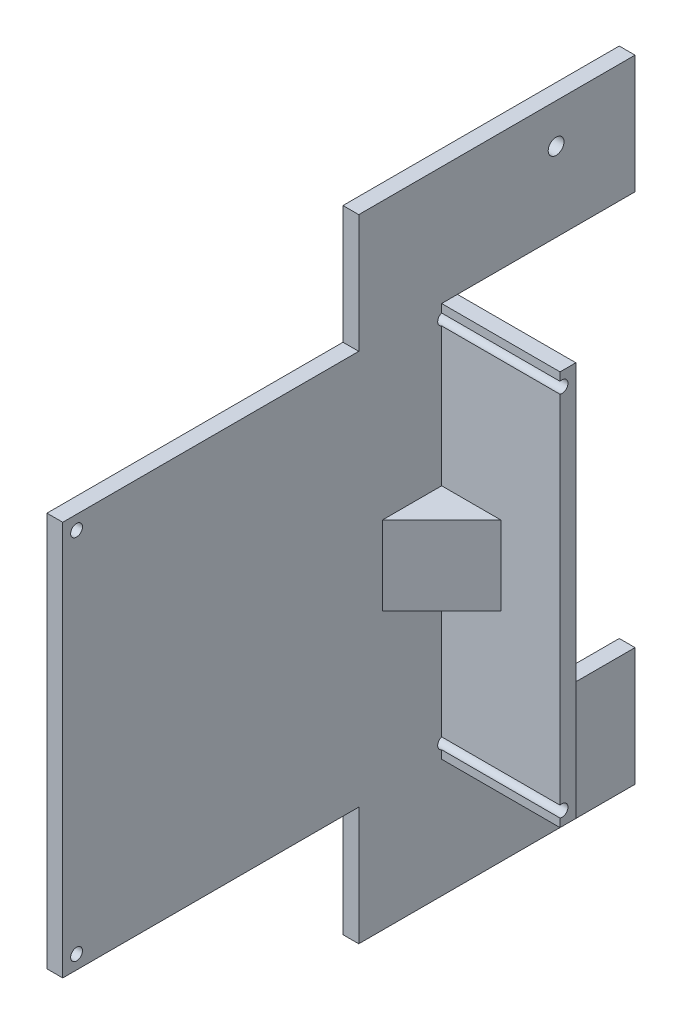
ISO-10303-21;
HEADER;
FILE_DESCRIPTION(('STEP AP214'),'2;1');
FILE_NAME('part.step','',(''),(''),'','','');
FILE_SCHEMA(('AUTOMOTIVE_DESIGN { 1 0 10303 214 1 1 1 1 }'));
ENDSEC;
DATA;
#1=APPLICATION_CONTEXT('core data for automotive mechanical design processes');
#2=APPLICATION_PROTOCOL_DEFINITION('international standard','automotive_design',2000,#1);
#3=PRODUCT_CONTEXT('',#1,'mechanical');
#4=PRODUCT('Part','Part','',(#3));
#5=PRODUCT_RELATED_PRODUCT_CATEGORY('part','',(#4));
#6=PRODUCT_DEFINITION_FORMATION('','',#4);
#7=PRODUCT_DEFINITION_CONTEXT('part definition',#1,'design');
#8=PRODUCT_DEFINITION('design','',#6,#7);
#9=PRODUCT_DEFINITION_SHAPE('','',#8);
#10=(LENGTH_UNIT() NAMED_UNIT(*) SI_UNIT(.MILLI.,.METRE.));
#11=(NAMED_UNIT(*) PLANE_ANGLE_UNIT() SI_UNIT($,.RADIAN.));
#12=(NAMED_UNIT(*) SI_UNIT($,.STERADIAN.) SOLID_ANGLE_UNIT());
#13=UNCERTAINTY_MEASURE_WITH_UNIT(LENGTH_MEASURE(1.E-05),#10,'distance_accuracy_value','');
#14=(GEOMETRIC_REPRESENTATION_CONTEXT(3) GLOBAL_UNCERTAINTY_ASSIGNED_CONTEXT((#13)) GLOBAL_UNIT_ASSIGNED_CONTEXT((#10,
#11,#12)) REPRESENTATION_CONTEXT('',''));
#15=CARTESIAN_POINT('',(0.,0.,0.));
#16=DIRECTION('',(0.,0.,1.));
#17=DIRECTION('',(1.,0.,0.));
#18=AXIS2_PLACEMENT_3D('',#15,#16,#17);
#19=CARTESIAN_POINT('',(34.,50.,-46.));
#20=DIRECTION('',(0.,0.,-1.));
#21=DIRECTION('',(0.,1.,0.));
#22=AXIS2_PLACEMENT_3D('',#19,#20,#21);
#23=PLANE('',#22);
#24=DIRECTION('',(0.,-1.,0.));
#25=VECTOR('',#24,1.);
#26=CARTESIAN_POINT('',(34.,50.,-46.));
#27=LINE('',#26,#25);
#28=CARTESIAN_POINT('',(34.,-47.9142135623731,-46.));
#29=VERTEX_POINT('',#28);
#30=CARTESIAN_POINT('',(34.,-50.,-46.));
#31=VERTEX_POINT('',#30);
#32=EDGE_CURVE('E390',#29,#31,#27,.T.);
#33=ORIENTED_EDGE('',*,*,#32,.F.);
#34=DIRECTION('',(-1.,0.,0.));
#35=VECTOR('',#34,1.);
#36=CARTESIAN_POINT('',(34.,-47.9142135623731,-46.));
#37=LINE('',#36,#35);
#38=CARTESIAN_POINT('',(4.,-47.9142135623731,-46.));
#39=VERTEX_POINT('',#38);
#40=EDGE_CURVE('E72',#29,#39,#37,.T.);
#41=ORIENTED_EDGE('',*,*,#40,.T.);
#42=DIRECTION('',(0.,-1.,0.));
#43=VECTOR('',#42,1.);
#44=CARTESIAN_POINT('',(4.,50.,-46.));
#45=LINE('',#44,#43);
#46=CARTESIAN_POINT('',(4.,-50.,-46.));
#47=VERTEX_POINT('',#46);
#48=EDGE_CURVE('E335',#39,#47,#45,.T.);
#49=ORIENTED_EDGE('',*,*,#48,.T.);
#50=DIRECTION('',(-1.,0.,0.));
#51=VECTOR('',#50,1.);
#52=CARTESIAN_POINT('',(34.,-50.,-46.));
#53=LINE('',#52,#51);
#54=EDGE_CURVE('E400',#31,#47,#53,.T.);
#55=ORIENTED_EDGE('',*,*,#54,.F.);
#56=EDGE_LOOP('',(#33,#41,#49,#55));
#57=FACE_BOUND('',#56,.T.);
#58=ADVANCED_FACE('F45',(#57),#23,.F.);
#59=DIRECTION('',(0.,1.,0.));
#60=VECTOR('',#59,1.);
#61=CARTESIAN_POINT('',(19.,-10.,-46.));
#62=LINE('',#61,#60);
#63=CARTESIAN_POINT('',(19.,-10.,-46.));
#64=VERTEX_POINT('',#63);
#65=CARTESIAN_POINT('',(19.,10.,-46.));
#66=VERTEX_POINT('',#65);
#67=EDGE_CURVE('E204',#64,#66,#62,.T.);
#68=ORIENTED_EDGE('',*,*,#67,.F.);
#69=DIRECTION('',(-1.,0.,0.));
#70=VECTOR('',#69,1.);
#71=CARTESIAN_POINT('',(19.,-10.,-46.));
#72=LINE('',#71,#70);
#73=CARTESIAN_POINT('',(4.,-10.,-46.));
#74=VERTEX_POINT('',#73);
#75=EDGE_CURVE('E220',#64,#74,#72,.T.);
#76=ORIENTED_EDGE('',*,*,#75,.T.);
#77=CARTESIAN_POINT('',(4.,-45.0857864376269,-46.));
#78=VERTEX_POINT('',#77);
#79=EDGE_CURVE('E405',#74,#78,#45,.T.);
#80=ORIENTED_EDGE('',*,*,#79,.T.);
#81=DIRECTION('',(-1.,0.,0.));
#82=VECTOR('',#81,1.);
#83=CARTESIAN_POINT('',(34.,-45.0857864376269,-46.));
#84=LINE('',#83,#82);
#85=CARTESIAN_POINT('',(34.,-45.0857864376269,-46.));
#86=VERTEX_POINT('',#85);
#87=EDGE_CURVE('E263',#78,#86,#84,.F.);
#88=ORIENTED_EDGE('',*,*,#87,.T.);
#89=CARTESIAN_POINT('',(34.,45.0857864376269,-46.));
#90=VERTEX_POINT('',#89);
#91=EDGE_CURVE('E396',#90,#86,#27,.T.);
#92=ORIENTED_EDGE('',*,*,#91,.F.);
#93=DIRECTION('',(-1.,0.,0.));
#94=VECTOR('',#93,1.);
#95=CARTESIAN_POINT('',(34.,45.0857864376269,-46.));
#96=LINE('',#95,#94);
#97=CARTESIAN_POINT('',(4.,45.0857864376269,-46.));
#98=VERTEX_POINT('',#97);
#99=EDGE_CURVE('E259',#90,#98,#96,.T.);
#100=ORIENTED_EDGE('',*,*,#99,.T.);
#101=CARTESIAN_POINT('',(4.,10.,-46.));
#102=VERTEX_POINT('',#101);
#103=EDGE_CURVE('E404',#98,#102,#45,.T.);
#104=ORIENTED_EDGE('',*,*,#103,.T.);
#105=DIRECTION('',(-1.,0.,0.));
#106=VECTOR('',#105,1.);
#107=CARTESIAN_POINT('',(19.,10.,-46.));
#108=LINE('',#107,#106);
#109=EDGE_CURVE('E64',#66,#102,#108,.T.);
#110=ORIENTED_EDGE('',*,*,#109,.F.);
#111=EDGE_LOOP('',(#68,#76,#80,#88,#92,#100,#104,#110));
#112=FACE_BOUND('',#111,.T.);
#113=ADVANCED_FACE('F502',(#112),#23,.F.);
#114=CARTESIAN_POINT('',(4.,-50.,50.));
#115=DIRECTION('',(0.,1.,0.));
#116=DIRECTION('',(0.,0.,1.));
#117=AXIS2_PLACEMENT_3D('',#114,#115,#116);
#118=PLANE('',#117);
#119=DIRECTION('',(-1.,0.,0.));
#120=VECTOR('',#119,1.);
#121=CARTESIAN_POINT('',(4.,-50.,-25.));
#122=LINE('',#121,#120);
#123=CARTESIAN_POINT('',(4.,-50.,-25.));
#124=VERTEX_POINT('',#123);
#125=CARTESIAN_POINT('',(0.,-50.,-25.));
#126=VERTEX_POINT('',#125);
#127=EDGE_CURVE('E344',#124,#126,#122,.T.);
#128=ORIENTED_EDGE('',*,*,#127,.F.);
#129=DIRECTION('',(0.,0.,-1.));
#130=VECTOR('',#129,1.);
#131=CARTESIAN_POINT('',(4.,-50.,50.));
#132=LINE('',#131,#130);
#133=CARTESIAN_POINT('',(4.,-50.,50.));
#134=VERTEX_POINT('',#133);
#135=EDGE_CURVE('E418',#134,#124,#132,.T.);
#136=ORIENTED_EDGE('',*,*,#135,.F.);
#137=DIRECTION('',(-1.,0.,0.));
#138=VECTOR('',#137,1.);
#139=CARTESIAN_POINT('',(4.,-50.,50.));
#140=LINE('',#139,#138);
#141=CARTESIAN_POINT('',(0.,-50.,50.));
#142=VERTEX_POINT('',#141);
#143=EDGE_CURVE('E49',#134,#142,#140,.T.);
#144=ORIENTED_EDGE('',*,*,#143,.T.);
#145=DIRECTION('',(0.,0.,-1.));
#146=VECTOR('',#145,1.);
#147=CARTESIAN_POINT('',(0.,-50.,50.));
#148=LINE('',#147,#146);
#149=EDGE_CURVE('E430',#142,#126,#148,.T.);
#150=ORIENTED_EDGE('',*,*,#149,.T.);
#151=EDGE_LOOP('',(#128,#136,#144,#150));
#152=FACE_BOUND('',#151,.T.);
#153=ADVANCED_FACE('F530',(#152),#118,.F.);
#154=CARTESIAN_POINT('',(4.,50.,50.));
#155=DIRECTION('',(0.,-1.,0.));
#156=DIRECTION('',(0.,0.,-1.));
#157=AXIS2_PLACEMENT_3D('',#154,#155,#156);
#158=PLANE('',#157);
#159=DIRECTION('',(-1.,0.,0.));
#160=VECTOR('',#159,1.);
#161=CARTESIAN_POINT('',(4.,50.,-50.));
#162=LINE('',#161,#160);
#163=CARTESIAN_POINT('',(34.,50.,-50.));
#164=VERTEX_POINT('',#163);
#165=CARTESIAN_POINT('',(4.,50.,-50.));
#166=VERTEX_POINT('',#165);
#167=EDGE_CURVE('E444',#164,#166,#162,.T.);
#168=ORIENTED_EDGE('',*,*,#167,.T.);
#169=DIRECTION('',(0.,0.,1.));
#170=VECTOR('',#169,1.);
#171=CARTESIAN_POINT('',(4.,50.,-25.));
#172=LINE('',#171,#170);
#173=CARTESIAN_POINT('',(4.,50.,-46.));
#174=VERTEX_POINT('',#173);
#175=EDGE_CURVE('E55',#166,#174,#172,.T.);
#176=ORIENTED_EDGE('',*,*,#175,.T.);
#177=DIRECTION('',(-1.,0.,0.));
#178=VECTOR('',#177,1.);
#179=CARTESIAN_POINT('',(34.,50.,-46.));
#180=LINE('',#179,#178);
#181=CARTESIAN_POINT('',(34.,50.,-46.));
#182=VERTEX_POINT('',#181);
#183=EDGE_CURVE('E409',#182,#174,#180,.T.);
#184=ORIENTED_EDGE('',*,*,#183,.F.);
#185=DIRECTION('',(0.,0.,1.));
#186=VECTOR('',#185,1.);
#187=CARTESIAN_POINT('',(34.,50.,-50.));
#188=LINE('',#187,#186);
#189=EDGE_CURVE('E386',#164,#182,#188,.T.);
#190=ORIENTED_EDGE('',*,*,#189,.F.);
#191=EDGE_LOOP('',(#168,#176,#184,#190));
#192=FACE_BOUND('',#191,.T.);
#193=ADVANCED_FACE('F492',(#192),#158,.F.);
#194=CARTESIAN_POINT('',(4.,50.,50.));
#195=DIRECTION('',(0.,0.,-1.));
#196=DIRECTION('',(0.,1.,0.));
#197=AXIS2_PLACEMENT_3D('',#194,#195,#196);
#198=PLANE('',#197);
#199=DIRECTION('',(0.,-1.,0.));
#200=VECTOR('',#199,1.);
#201=CARTESIAN_POINT('',(0.,50.,50.));
#202=LINE('',#201,#200);
#203=CARTESIAN_POINT('',(0.,50.,50.));
#204=VERTEX_POINT('',#203);
#205=EDGE_CURVE('E413',#204,#142,#202,.T.);
#206=ORIENTED_EDGE('',*,*,#205,.T.);
#207=ORIENTED_EDGE('',*,*,#143,.F.);
#208=DIRECTION('',(0.,-1.,0.));
#209=VECTOR('',#208,1.);
#210=CARTESIAN_POINT('',(4.,50.,50.));
#211=LINE('',#210,#209);
#212=CARTESIAN_POINT('',(4.,50.,50.));
#213=VERTEX_POINT('',#212);
#214=EDGE_CURVE('E414',#213,#134,#211,.T.);
#215=ORIENTED_EDGE('',*,*,#214,.F.);
#216=DIRECTION('',(-1.,0.,0.));
#217=VECTOR('',#216,1.);
#218=CARTESIAN_POINT('',(4.,50.,50.));
#219=LINE('',#218,#217);
#220=EDGE_CURVE('E426',#213,#204,#219,.T.);
#221=ORIENTED_EDGE('',*,*,#220,.T.);
#222=EDGE_LOOP('',(#206,#207,#215,#221));
#223=FACE_BOUND('',#222,.T.);
#224=ADVANCED_FACE('F47',(#223),#198,.F.);
#225=ORIENTED_EDGE('',*,*,#54,.T.);
#226=DIRECTION('',(0.,0.,-1.));
#227=VECTOR('',#226,1.);
#228=CARTESIAN_POINT('',(4.,-50.,-25.));
#229=LINE('',#228,#227);
#230=CARTESIAN_POINT('',(4.,-50.,-50.));
#231=VERTEX_POINT('',#230);
#232=EDGE_CURVE('E11',#47,#231,#229,.T.);
#233=ORIENTED_EDGE('',*,*,#232,.T.);
#234=DIRECTION('',(-1.,0.,0.));
#235=VECTOR('',#234,1.);
#236=CARTESIAN_POINT('',(4.,-50.,-50.));
#237=LINE('',#236,#235);
#238=CARTESIAN_POINT('',(34.,-50.,-50.));
#239=VERTEX_POINT('',#238);
#240=EDGE_CURVE('E448',#239,#231,#237,.T.);
#241=ORIENTED_EDGE('',*,*,#240,.F.);
#242=DIRECTION('',(0.,0.,-1.));
#243=VECTOR('',#242,1.);
#244=CARTESIAN_POINT('',(34.,-50.,-50.));
#245=LINE('',#244,#243);
#246=EDGE_CURVE('E395',#31,#239,#245,.T.);
#247=ORIENTED_EDGE('',*,*,#246,.F.);
#248=EDGE_LOOP('',(#225,#233,#241,#247));
#249=FACE_BOUND('',#248,.T.);
#250=ADVANCED_FACE('F486',(#249),#118,.F.);
#251=CARTESIAN_POINT('',(4.,50.,-50.));
#252=DIRECTION('',(0.,0.,1.));
#253=DIRECTION('',(0.,-1.,0.));
#254=AXIS2_PLACEMENT_3D('',#251,#252,#253);
#255=PLANE('',#254);
#256=DIRECTION('',(0.,1.,0.));
#257=VECTOR('',#256,1.);
#258=CARTESIAN_POINT('',(0.,50.,-50.));
#259=LINE('',#258,#257);
#260=CARTESIAN_POINT('',(0.,-50.,-50.));
#261=VERTEX_POINT('',#260);
#262=CARTESIAN_POINT('',(0.,50.,-50.));
#263=VERTEX_POINT('',#262);
#264=EDGE_CURVE('E434',#261,#263,#259,.T.);
#265=ORIENTED_EDGE('',*,*,#264,.T.);
#266=EDGE_CURVE('E443',#166,#263,#162,.T.);
#267=ORIENTED_EDGE('',*,*,#266,.F.);
#268=ORIENTED_EDGE('',*,*,#167,.F.);
#269=DIRECTION('',(0.,1.,0.));
#270=VECTOR('',#269,1.);
#271=CARTESIAN_POINT('',(34.,50.,-50.));
#272=LINE('',#271,#270);
#273=EDGE_CURVE('E382',#239,#164,#272,.T.);
#274=ORIENTED_EDGE('',*,*,#273,.F.);
#275=ORIENTED_EDGE('',*,*,#240,.T.);
#276=EDGE_CURVE('E447',#231,#261,#237,.T.);
#277=ORIENTED_EDGE('',*,*,#276,.T.);
#278=EDGE_LOOP('',(#265,#267,#268,#274,#275,#277));
#279=FACE_BOUND('',#278,.T.);
#280=ADVANCED_FACE('F459',(#279),#255,.F.);
#281=DIRECTION('',(0.,0.,1.));
#282=VECTOR('',#281,1.);
#283=CARTESIAN_POINT('',(4.,50.,50.));
#284=LINE('',#283,#282);
#285=CARTESIAN_POINT('',(4.,50.,-25.));
#286=VERTEX_POINT('',#285);
#287=EDGE_CURVE('E423',#286,#213,#284,.T.);
#288=ORIENTED_EDGE('',*,*,#287,.F.);
#289=DIRECTION('',(-1.,0.,0.));
#290=VECTOR('',#289,1.);
#291=CARTESIAN_POINT('',(4.,50.,-25.));
#292=LINE('',#291,#290);
#293=CARTESIAN_POINT('',(0.,50.,-25.));
#294=VERTEX_POINT('',#293);
#295=EDGE_CURVE('E331',#286,#294,#292,.T.);
#296=ORIENTED_EDGE('',*,*,#295,.T.);
#297=DIRECTION('',(0.,0.,1.));
#298=VECTOR('',#297,1.);
#299=CARTESIAN_POINT('',(0.,50.,50.));
#300=LINE('',#299,#298);
#301=EDGE_CURVE('E419',#294,#204,#300,.T.);
#302=ORIENTED_EDGE('',*,*,#301,.T.);
#303=ORIENTED_EDGE('',*,*,#220,.F.);
#304=EDGE_LOOP('',(#288,#296,#302,#303));
#305=FACE_BOUND('',#304,.T.);
#306=ADVANCED_FACE('F543',(#305),#158,.F.);
#307=CARTESIAN_POINT('',(4.,0.,0.));
#308=DIRECTION('',(1.,0.,0.));
#309=DIRECTION('',(0.,0.,-1.));
#310=AXIS2_PLACEMENT_3D('',#307,#308,#309);
#311=PLANE('',#310);
#312=DIRECTION('',(0.,0.,1.));
#313=VECTOR('',#312,1.);
#314=CARTESIAN_POINT('',(4.,-10.,-46.));
#315=LINE('',#314,#313);
#316=CARTESIAN_POINT('',(4.,-10.,-31.));
#317=VERTEX_POINT('',#316);
#318=EDGE_CURVE('E218',#74,#317,#315,.T.);
#319=ORIENTED_EDGE('',*,*,#318,.T.);
#320=DIRECTION('',(0.,1.,0.));
#321=VECTOR('',#320,1.);
#322=CARTESIAN_POINT('',(4.,-10.,-31.));
#323=LINE('',#322,#321);
#324=CARTESIAN_POINT('',(4.,10.,-31.));
#325=VERTEX_POINT('',#324);
#326=EDGE_CURVE('E201',#317,#325,#323,.T.);
#327=ORIENTED_EDGE('',*,*,#326,.T.);
#328=DIRECTION('',(0.,0.,1.));
#329=VECTOR('',#328,1.);
#330=CARTESIAN_POINT('',(4.,10.,-46.));
#331=LINE('',#330,#329);
#332=EDGE_CURVE('E206',#102,#325,#331,.T.);
#333=ORIENTED_EDGE('',*,*,#332,.F.);
#334=ORIENTED_EDGE('',*,*,#103,.F.);
#335=CARTESIAN_POINT('',(4.,46.5,-46.5));
#336=DIRECTION('',(1.,0.,0.));
#337=DIRECTION('',(0.,0.,-1.));
#338=AXIS2_PLACEMENT_3D('',#335,#336,#337);
#339=CIRCLE('',#338,1.5);
#340=CARTESIAN_POINT('',(4.,47.9142135623731,-46.));
#341=VERTEX_POINT('',#340);
#342=EDGE_CURVE('E256',#341,#98,#339,.T.);
#343=ORIENTED_EDGE('',*,*,#342,.F.);
#344=EDGE_CURVE('E387',#174,#341,#45,.T.);
#345=ORIENTED_EDGE('',*,*,#344,.F.);
#346=ORIENTED_EDGE('',*,*,#175,.F.);
#347=CARTESIAN_POINT('',(4.,50.,-95.));
#348=VERTEX_POINT('',#347);
#349=EDGE_CURVE('E310',#348,#166,#172,.T.);
#350=ORIENTED_EDGE('',*,*,#349,.F.);
#351=DIRECTION('',(0.,-1.,0.));
#352=VECTOR('',#351,1.);
#353=CARTESIAN_POINT('',(4.,50.,-95.));
#354=LINE('',#353,#352);
#355=CARTESIAN_POINT('',(4.,80.,-95.));
#356=VERTEX_POINT('',#355);
#357=EDGE_CURVE('E306',#356,#348,#354,.T.);
#358=ORIENTED_EDGE('',*,*,#357,.F.);
#359=DIRECTION('',(0.,0.,-1.));
#360=VECTOR('',#359,1.);
#361=CARTESIAN_POINT('',(4.,80.,-25.));
#362=LINE('',#361,#360);
#363=CARTESIAN_POINT('',(4.,80.,-25.));
#364=VERTEX_POINT('',#363);
#365=EDGE_CURVE('E301',#364,#356,#362,.T.);
#366=ORIENTED_EDGE('',*,*,#365,.F.);
#367=DIRECTION('',(0.,1.,0.));
#368=VECTOR('',#367,1.);
#369=CARTESIAN_POINT('',(4.,50.,-25.));
#370=LINE('',#369,#368);
#371=EDGE_CURVE('E297',#286,#364,#370,.T.);
#372=ORIENTED_EDGE('',*,*,#371,.F.);
#373=ORIENTED_EDGE('',*,*,#287,.T.);
#374=ORIENTED_EDGE('',*,*,#214,.T.);
#375=ORIENTED_EDGE('',*,*,#135,.T.);
#376=DIRECTION('',(0.,1.,0.));
#377=VECTOR('',#376,1.);
#378=CARTESIAN_POINT('',(4.,-50.,-25.));
#379=LINE('',#378,#377);
#380=CARTESIAN_POINT('',(4.,-80.,-25.));
#381=VERTEX_POINT('',#380);
#382=EDGE_CURVE('E362',#381,#124,#379,.T.);
#383=ORIENTED_EDGE('',*,*,#382,.F.);
#384=DIRECTION('',(0.,0.,1.));
#385=VECTOR('',#384,1.);
#386=CARTESIAN_POINT('',(4.,-80.,-25.));
#387=LINE('',#386,#385);
#388=CARTESIAN_POINT('',(4.,-80.,-95.));
#389=VERTEX_POINT('',#388);
#390=EDGE_CURVE('E347',#389,#381,#387,.T.);
#391=ORIENTED_EDGE('',*,*,#390,.F.);
#392=DIRECTION('',(0.,-1.,0.));
#393=VECTOR('',#392,1.);
#394=CARTESIAN_POINT('',(4.,-50.,-95.));
#395=LINE('',#394,#393);
#396=CARTESIAN_POINT('',(4.,-50.,-95.));
#397=VERTEX_POINT('',#396);
#398=EDGE_CURVE('E375',#397,#389,#395,.T.);
#399=ORIENTED_EDGE('',*,*,#398,.F.);
#400=EDGE_CURVE('E57',#231,#397,#229,.T.);
#401=ORIENTED_EDGE('',*,*,#400,.F.);
#402=ORIENTED_EDGE('',*,*,#232,.F.);
#403=ORIENTED_EDGE('',*,*,#48,.F.);
#404=CARTESIAN_POINT('',(4.,-46.5,-46.5));
#405=DIRECTION('',(1.,0.,0.));
#406=DIRECTION('',(0.,0.,-1.));
#407=AXIS2_PLACEMENT_3D('',#404,#405,#406);
#408=CIRCLE('',#407,1.5);
#409=EDGE_CURVE('E267',#78,#39,#408,.T.);
#410=ORIENTED_EDGE('',*,*,#409,.F.);
#411=ORIENTED_EDGE('',*,*,#79,.F.);
#412=EDGE_LOOP('',(#319,#327,#333,#334,#343,#345,#346,#350,#358,#366,#372,#373,#374,#375,#383,
#391,#399,#401,#402,#403,#410,#411));
#413=FACE_BOUND('',#412,.T.);
#414=CARTESIAN_POINT('',(4.,-46.5,46.5));
#415=DIRECTION('',(1.,0.,0.));
#416=DIRECTION('',(0.,0.,-1.));
#417=AXIS2_PLACEMENT_3D('',#414,#415,#416);
#418=CIRCLE('',#417,1.5);
#419=CARTESIAN_POINT('',(4.,-46.5,45.));
#420=VERTEX_POINT('',#419);
#421=EDGE_CURVE('E276',#420,#420,#418,.T.);
#422=ORIENTED_EDGE('',*,*,#421,.F.);
#423=EDGE_LOOP('',(#422));
#424=FACE_BOUND('',#423,.T.);
#425=CARTESIAN_POINT('',(4.,46.5,46.5));
#426=DIRECTION('',(1.,0.,0.));
#427=DIRECTION('',(0.,0.,-1.));
#428=AXIS2_PLACEMENT_3D('',#425,#426,#427);
#429=CIRCLE('',#428,1.5);
#430=CARTESIAN_POINT('',(4.,46.5,45.));
#431=VERTEX_POINT('',#430);
#432=EDGE_CURVE('E272',#431,#431,#429,.T.);
#433=ORIENTED_EDGE('',*,*,#432,.F.);
#434=EDGE_LOOP('',(#433));
#435=FACE_BOUND('',#434,.T.);
#436=CARTESIAN_POINT('',(4.,70.,-75.));
#437=DIRECTION('',(1.,0.,0.));
#438=DIRECTION('',(0.,0.,-1.));
#439=AXIS2_PLACEMENT_3D('',#436,#437,#438);
#440=CIRCLE('',#439,2.);
#441=CARTESIAN_POINT('',(4.,70.,-77.));
#442=VERTEX_POINT('',#441);
#443=EDGE_CURVE('E286',#442,#442,#440,.T.);
#444=ORIENTED_EDGE('',*,*,#443,.F.);
#445=EDGE_LOOP('',(#444));
#446=FACE_BOUND('',#445,.T.);
#447=CARTESIAN_POINT('',(4.,-70.,-75.));
#448=DIRECTION('',(1.,0.,0.));
#449=DIRECTION('',(0.,0.,-1.));
#450=AXIS2_PLACEMENT_3D('',#447,#448,#449);
#451=CIRCLE('',#450,2.);
#452=CARTESIAN_POINT('',(4.,-70.,-77.));
#453=VERTEX_POINT('',#452);
#454=EDGE_CURVE('E290',#453,#453,#451,.T.);
#455=ORIENTED_EDGE('',*,*,#454,.F.);
#456=EDGE_LOOP('',(#455));
#457=FACE_BOUND('',#456,.T.);
#458=ADVANCED_FACE('F215',(#413,#424,#435,#446,#457),#311,.T.);
#459=CARTESIAN_POINT('',(0.,0.,0.));
#460=DIRECTION('',(1.,0.,0.));
#461=DIRECTION('',(0.,0.,-1.));
#462=AXIS2_PLACEMENT_3D('',#459,#460,#461);
#463=PLANE('',#462);
#464=CARTESIAN_POINT('',(0.,-46.5,46.5));
#465=DIRECTION('',(-1.,0.,0.));
#466=DIRECTION('',(0.,0.,1.));
#467=AXIS2_PLACEMENT_3D('',#464,#465,#466);
#468=CIRCLE('',#467,1.5);
#469=CARTESIAN_POINT('',(0.,-46.5,48.));
#470=VERTEX_POINT('',#469);
#471=EDGE_CURVE('E224',#470,#470,#468,.T.);
#472=ORIENTED_EDGE('',*,*,#471,.F.);
#473=EDGE_LOOP('',(#472));
#474=FACE_BOUND('',#473,.T.);
#475=CARTESIAN_POINT('',(0.,-46.5,-46.5));
#476=DIRECTION('',(-1.,0.,0.));
#477=DIRECTION('',(0.,0.,1.));
#478=AXIS2_PLACEMENT_3D('',#475,#476,#477);
#479=CIRCLE('',#478,1.5);
#480=CARTESIAN_POINT('',(0.,-46.5,-45.));
#481=VERTEX_POINT('',#480);
#482=EDGE_CURVE('E239',#481,#481,#479,.T.);
#483=ORIENTED_EDGE('',*,*,#482,.F.);
#484=EDGE_LOOP('',(#483));
#485=FACE_BOUND('',#484,.T.);
#486=CARTESIAN_POINT('',(0.,46.5,-46.5));
#487=DIRECTION('',(-1.,0.,0.));
#488=DIRECTION('',(0.,0.,1.));
#489=AXIS2_PLACEMENT_3D('',#486,#487,#488);
#490=CIRCLE('',#489,1.5);
#491=CARTESIAN_POINT('',(0.,46.5,-45.));
#492=VERTEX_POINT('',#491);
#493=EDGE_CURVE('E230',#492,#492,#490,.T.);
#494=ORIENTED_EDGE('',*,*,#493,.F.);
#495=EDGE_LOOP('',(#494));
#496=FACE_BOUND('',#495,.T.);
#497=CARTESIAN_POINT('',(0.,46.5,46.5));
#498=DIRECTION('',(-1.,0.,0.));
#499=DIRECTION('',(0.,0.,1.));
#500=AXIS2_PLACEMENT_3D('',#497,#498,#499);
#501=CIRCLE('',#500,1.5);
#502=CARTESIAN_POINT('',(0.,46.5,48.));
#503=VERTEX_POINT('',#502);
#504=EDGE_CURVE('E234',#503,#503,#501,.T.);
#505=ORIENTED_EDGE('',*,*,#504,.F.);
#506=EDGE_LOOP('',(#505));
#507=FACE_BOUND('',#506,.T.);
#508=CARTESIAN_POINT('',(0.,70.,-75.));
#509=DIRECTION('',(1.,0.,0.));
#510=DIRECTION('',(0.,0.,-1.));
#511=AXIS2_PLACEMENT_3D('',#508,#509,#510);
#512=CIRCLE('',#511,2.);
#513=CARTESIAN_POINT('',(0.,70.,-77.));
#514=VERTEX_POINT('',#513);
#515=EDGE_CURVE('E281',#514,#514,#512,.T.);
#516=ORIENTED_EDGE('',*,*,#515,.T.);
#517=EDGE_LOOP('',(#516));
#518=FACE_BOUND('',#517,.T.);
#519=CARTESIAN_POINT('',(0.,-70.,-75.));
#520=DIRECTION('',(1.,0.,0.));
#521=DIRECTION('',(0.,0.,-1.));
#522=AXIS2_PLACEMENT_3D('',#519,#520,#521);
#523=CIRCLE('',#522,2.);
#524=CARTESIAN_POINT('',(0.,-70.,-77.));
#525=VERTEX_POINT('',#524);
#526=EDGE_CURVE('E280',#525,#525,#523,.T.);
#527=ORIENTED_EDGE('',*,*,#526,.T.);
#528=EDGE_LOOP('',(#527));
#529=FACE_BOUND('',#528,.T.);
#530=ORIENTED_EDGE('',*,*,#205,.F.);
#531=ORIENTED_EDGE('',*,*,#301,.F.);
#532=DIRECTION('',(0.,1.,0.));
#533=VECTOR('',#532,1.);
#534=CARTESIAN_POINT('',(0.,50.,-25.));
#535=LINE('',#534,#533);
#536=CARTESIAN_POINT('',(0.,80.,-25.));
#537=VERTEX_POINT('',#536);
#538=EDGE_CURVE('E315',#294,#537,#535,.T.);
#539=ORIENTED_EDGE('',*,*,#538,.T.);
#540=DIRECTION('',(0.,0.,-1.));
#541=VECTOR('',#540,1.);
#542=CARTESIAN_POINT('',(0.,80.,-25.));
#543=LINE('',#542,#541);
#544=CARTESIAN_POINT('',(0.,80.,-95.));
#545=VERTEX_POINT('',#544);
#546=EDGE_CURVE('E319',#537,#545,#543,.T.);
#547=ORIENTED_EDGE('',*,*,#546,.T.);
#548=DIRECTION('',(0.,-1.,0.));
#549=VECTOR('',#548,1.);
#550=CARTESIAN_POINT('',(0.,50.,-95.));
#551=LINE('',#550,#549);
#552=CARTESIAN_POINT('',(0.,50.,-95.));
#553=VERTEX_POINT('',#552);
#554=EDGE_CURVE('E324',#545,#553,#551,.T.);
#555=ORIENTED_EDGE('',*,*,#554,.T.);
#556=DIRECTION('',(0.,0.,1.));
#557=VECTOR('',#556,1.);
#558=CARTESIAN_POINT('',(0.,50.,-25.));
#559=LINE('',#558,#557);
#560=EDGE_CURVE('E302',#553,#263,#559,.T.);
#561=ORIENTED_EDGE('',*,*,#560,.T.);
#562=ORIENTED_EDGE('',*,*,#264,.F.);
#563=DIRECTION('',(0.,0.,-1.));
#564=VECTOR('',#563,1.);
#565=CARTESIAN_POINT('',(0.,-50.,-25.));
#566=LINE('',#565,#564);
#567=CARTESIAN_POINT('',(0.,-50.,-95.));
#568=VERTEX_POINT('',#567);
#569=EDGE_CURVE('E366',#261,#568,#566,.T.);
#570=ORIENTED_EDGE('',*,*,#569,.T.);
#571=DIRECTION('',(0.,-1.,0.));
#572=VECTOR('',#571,1.);
#573=CARTESIAN_POINT('',(0.,-50.,-95.));
#574=LINE('',#573,#572);
#575=CARTESIAN_POINT('',(0.,-80.,-95.));
#576=VERTEX_POINT('',#575);
#577=EDGE_CURVE('E361',#568,#576,#574,.T.);
#578=ORIENTED_EDGE('',*,*,#577,.T.);
#579=DIRECTION('',(0.,0.,1.));
#580=VECTOR('',#579,1.);
#581=CARTESIAN_POINT('',(0.,-80.,-25.));
#582=LINE('',#581,#580);
#583=CARTESIAN_POINT('',(0.,-80.,-25.));
#584=VERTEX_POINT('',#583);
#585=EDGE_CURVE('E357',#576,#584,#582,.T.);
#586=ORIENTED_EDGE('',*,*,#585,.T.);
#587=DIRECTION('',(0.,1.,0.));
#588=VECTOR('',#587,1.);
#589=CARTESIAN_POINT('',(0.,-50.,-25.));
#590=LINE('',#589,#588);
#591=EDGE_CURVE('E320',#584,#126,#590,.T.);
#592=ORIENTED_EDGE('',*,*,#591,.T.);
#593=ORIENTED_EDGE('',*,*,#149,.F.);
#594=EDGE_LOOP('',(#530,#531,#539,#547,#555,#561,#562,#570,#578,#586,#592,#593));
#595=FACE_BOUND('',#594,.T.);
#596=ADVANCED_FACE('F464',(#474,#485,#496,#507,#518,#529,#595),#463,.F.);
#597=ORIENTED_EDGE('',*,*,#344,.T.);
#598=DIRECTION('',(-1.,0.,0.));
#599=VECTOR('',#598,1.);
#600=CARTESIAN_POINT('',(34.,47.9142135623731,-46.));
#601=LINE('',#600,#599);
#602=CARTESIAN_POINT('',(34.,47.9142135623731,-46.));
#603=VERTEX_POINT('',#602);
#604=EDGE_CURVE('E252',#341,#603,#601,.F.);
#605=ORIENTED_EDGE('',*,*,#604,.T.);
#606=EDGE_CURVE('E391',#182,#603,#27,.T.);
#607=ORIENTED_EDGE('',*,*,#606,.F.);
#608=ORIENTED_EDGE('',*,*,#183,.T.);
#609=EDGE_LOOP('',(#597,#605,#607,#608));
#610=FACE_BOUND('',#609,.T.);
#611=ADVANCED_FACE('F496',(#610),#23,.F.);
#612=CARTESIAN_POINT('',(34.,0.,0.));
#613=DIRECTION('',(-1.,0.,0.));
#614=DIRECTION('',(0.,0.,1.));
#615=AXIS2_PLACEMENT_3D('',#612,#613,#614);
#616=PLANE('',#615);
#617=ORIENTED_EDGE('',*,*,#91,.T.);
#618=CARTESIAN_POINT('',(34.,-46.5,-46.5));
#619=DIRECTION('',(-1.,0.,0.));
#620=DIRECTION('',(0.,0.,1.));
#621=AXIS2_PLACEMENT_3D('',#618,#619,#620);
#622=CIRCLE('',#621,1.5);
#623=EDGE_CURVE('E243',#86,#29,#622,.T.);
#624=ORIENTED_EDGE('',*,*,#623,.T.);
#625=ORIENTED_EDGE('',*,*,#32,.T.);
#626=ORIENTED_EDGE('',*,*,#246,.T.);
#627=ORIENTED_EDGE('',*,*,#273,.T.);
#628=ORIENTED_EDGE('',*,*,#189,.T.);
#629=ORIENTED_EDGE('',*,*,#606,.T.);
#630=CARTESIAN_POINT('',(34.,46.5,-46.5));
#631=DIRECTION('',(-1.,0.,0.));
#632=DIRECTION('',(0.,0.,1.));
#633=AXIS2_PLACEMENT_3D('',#630,#631,#632);
#634=CIRCLE('',#633,1.5);
#635=EDGE_CURVE('E235',#603,#90,#634,.T.);
#636=ORIENTED_EDGE('',*,*,#635,.T.);
#637=EDGE_LOOP('',(#617,#624,#625,#626,#627,#628,#629,#636));
#638=FACE_BOUND('',#637,.T.);
#639=ADVANCED_FACE('F488',(#638),#616,.F.);
#640=CARTESIAN_POINT('',(4.,50.,-25.));
#641=DIRECTION('',(0.,0.,1.));
#642=DIRECTION('',(1.,0.,0.));
#643=AXIS2_PLACEMENT_3D('',#640,#641,#642);
#644=PLANE('',#643);
#645=ORIENTED_EDGE('',*,*,#538,.F.);
#646=ORIENTED_EDGE('',*,*,#295,.F.);
#647=ORIENTED_EDGE('',*,*,#371,.T.);
#648=DIRECTION('',(-1.,0.,0.));
#649=VECTOR('',#648,1.);
#650=CARTESIAN_POINT('',(4.,80.,-25.));
#651=LINE('',#650,#649);
#652=EDGE_CURVE('E314',#364,#537,#651,.T.);
#653=ORIENTED_EDGE('',*,*,#652,.T.);
#654=EDGE_LOOP('',(#645,#646,#647,#653));
#655=FACE_BOUND('',#654,.T.);
#656=ADVANCED_FACE('F537',(#655),#644,.T.);
#657=CARTESIAN_POINT('',(4.,50.,-25.));
#658=DIRECTION('',(0.,-1.,0.));
#659=DIRECTION('',(0.,0.,-1.));
#660=AXIS2_PLACEMENT_3D('',#657,#658,#659);
#661=PLANE('',#660);
#662=ORIENTED_EDGE('',*,*,#349,.T.);
#663=ORIENTED_EDGE('',*,*,#266,.T.);
#664=ORIENTED_EDGE('',*,*,#560,.F.);
#665=DIRECTION('',(-1.,0.,0.));
#666=VECTOR('',#665,1.);
#667=CARTESIAN_POINT('',(4.,50.,-95.));
#668=LINE('',#667,#666);
#669=EDGE_CURVE('E336',#348,#553,#668,.T.);
#670=ORIENTED_EDGE('',*,*,#669,.F.);
#671=EDGE_LOOP('',(#662,#663,#664,#670));
#672=FACE_BOUND('',#671,.T.);
#673=ADVANCED_FACE('F468',(#672),#661,.T.);
#674=CARTESIAN_POINT('',(4.,50.,-95.));
#675=DIRECTION('',(0.,0.,-1.));
#676=DIRECTION('',(-1.,0.,0.));
#677=AXIS2_PLACEMENT_3D('',#674,#675,#676);
#678=PLANE('',#677);
#679=ORIENTED_EDGE('',*,*,#554,.F.);
#680=DIRECTION('',(-1.,0.,0.));
#681=VECTOR('',#680,1.);
#682=CARTESIAN_POINT('',(4.,80.,-95.));
#683=LINE('',#682,#681);
#684=EDGE_CURVE('E339',#356,#545,#683,.T.);
#685=ORIENTED_EDGE('',*,*,#684,.F.);
#686=ORIENTED_EDGE('',*,*,#357,.T.);
#687=ORIENTED_EDGE('',*,*,#669,.T.);
#688=EDGE_LOOP('',(#679,#685,#686,#687));
#689=FACE_BOUND('',#688,.T.);
#690=ADVANCED_FACE('F589',(#689),#678,.T.);
#691=CARTESIAN_POINT('',(4.,80.,-25.));
#692=DIRECTION('',(0.,1.,0.));
#693=DIRECTION('',(0.,0.,1.));
#694=AXIS2_PLACEMENT_3D('',#691,#692,#693);
#695=PLANE('',#694);
#696=ORIENTED_EDGE('',*,*,#546,.F.);
#697=ORIENTED_EDGE('',*,*,#652,.F.);
#698=ORIENTED_EDGE('',*,*,#365,.T.);
#699=ORIENTED_EDGE('',*,*,#684,.T.);
#700=EDGE_LOOP('',(#696,#697,#698,#699));
#701=FACE_BOUND('',#700,.T.);
#702=ADVANCED_FACE('F582',(#701),#695,.T.);
#703=CARTESIAN_POINT('',(4.,-50.,-25.));
#704=DIRECTION('',(0.,1.,0.));
#705=DIRECTION('',(0.,0.,1.));
#706=AXIS2_PLACEMENT_3D('',#703,#704,#705);
#707=PLANE('',#706);
#708=ORIENTED_EDGE('',*,*,#276,.F.);
#709=ORIENTED_EDGE('',*,*,#400,.T.);
#710=DIRECTION('',(-1.,0.,0.));
#711=VECTOR('',#710,1.);
#712=CARTESIAN_POINT('',(4.,-50.,-95.));
#713=LINE('',#712,#711);
#714=EDGE_CURVE('E348',#397,#568,#713,.T.);
#715=ORIENTED_EDGE('',*,*,#714,.T.);
#716=ORIENTED_EDGE('',*,*,#569,.F.);
#717=EDGE_LOOP('',(#708,#709,#715,#716));
#718=FACE_BOUND('',#717,.T.);
#719=ADVANCED_FACE('F580',(#718),#707,.T.);
#720=CARTESIAN_POINT('',(4.,-50.,-25.));
#721=DIRECTION('',(0.,0.,1.));
#722=DIRECTION('',(0.,-1.,0.));
#723=AXIS2_PLACEMENT_3D('',#720,#721,#722);
#724=PLANE('',#723);
#725=ORIENTED_EDGE('',*,*,#591,.F.);
#726=DIRECTION('',(-1.,0.,0.));
#727=VECTOR('',#726,1.);
#728=CARTESIAN_POINT('',(4.,-80.,-25.));
#729=LINE('',#728,#727);
#730=EDGE_CURVE('E285',#381,#584,#729,.T.);
#731=ORIENTED_EDGE('',*,*,#730,.F.);
#732=ORIENTED_EDGE('',*,*,#382,.T.);
#733=ORIENTED_EDGE('',*,*,#127,.T.);
#734=EDGE_LOOP('',(#725,#731,#732,#733));
#735=FACE_BOUND('',#734,.T.);
#736=ADVANCED_FACE('F573',(#735),#724,.T.);
#737=CARTESIAN_POINT('',(4.,-80.,-25.));
#738=DIRECTION('',(0.,-1.,0.));
#739=DIRECTION('',(0.,0.,-1.));
#740=AXIS2_PLACEMENT_3D('',#737,#738,#739);
#741=PLANE('',#740);
#742=ORIENTED_EDGE('',*,*,#585,.F.);
#743=DIRECTION('',(-1.,0.,0.));
#744=VECTOR('',#743,1.);
#745=CARTESIAN_POINT('',(4.,-80.,-95.));
#746=LINE('',#745,#744);
#747=EDGE_CURVE('E352',#389,#576,#746,.T.);
#748=ORIENTED_EDGE('',*,*,#747,.F.);
#749=ORIENTED_EDGE('',*,*,#390,.T.);
#750=ORIENTED_EDGE('',*,*,#730,.T.);
#751=EDGE_LOOP('',(#742,#748,#749,#750));
#752=FACE_BOUND('',#751,.T.);
#753=ADVANCED_FACE('F575',(#752),#741,.T.);
#754=CARTESIAN_POINT('',(4.,-50.,-95.));
#755=DIRECTION('',(0.,0.,-1.));
#756=DIRECTION('',(0.,1.,0.));
#757=AXIS2_PLACEMENT_3D('',#754,#755,#756);
#758=PLANE('',#757);
#759=ORIENTED_EDGE('',*,*,#577,.F.);
#760=ORIENTED_EDGE('',*,*,#714,.F.);
#761=ORIENTED_EDGE('',*,*,#398,.T.);
#762=ORIENTED_EDGE('',*,*,#747,.T.);
#763=EDGE_LOOP('',(#759,#760,#761,#762));
#764=FACE_BOUND('',#763,.T.);
#765=ADVANCED_FACE('F579',(#764),#758,.T.);
#766=CARTESIAN_POINT('',(0.,-70.,-75.));
#767=DIRECTION('',(1.,0.,0.));
#768=DIRECTION('',(0.,0.,-1.));
#769=AXIS2_PLACEMENT_3D('',#766,#767,#768);
#770=CYLINDRICAL_SURFACE('',#769,2.);
#771=ORIENTED_EDGE('',*,*,#526,.F.);
#772=EDGE_LOOP('',(#771));
#773=FACE_BOUND('',#772,.T.);
#774=ORIENTED_EDGE('',*,*,#454,.T.);
#775=EDGE_LOOP('',(#774));
#776=FACE_BOUND('',#775,.T.);
#777=ADVANCED_FACE('F596',(#773,#776),#770,.F.);
#778=CARTESIAN_POINT('',(0.,70.,-75.));
#779=DIRECTION('',(1.,0.,0.));
#780=DIRECTION('',(0.,0.,-1.));
#781=AXIS2_PLACEMENT_3D('',#778,#779,#780);
#782=CYLINDRICAL_SURFACE('',#781,2.);
#783=ORIENTED_EDGE('',*,*,#515,.F.);
#784=EDGE_LOOP('',(#783));
#785=FACE_BOUND('',#784,.T.);
#786=ORIENTED_EDGE('',*,*,#443,.T.);
#787=EDGE_LOOP('',(#786));
#788=FACE_BOUND('',#787,.T.);
#789=ADVANCED_FACE('F613',(#785,#788),#782,.F.);
#790=CARTESIAN_POINT('',(34.,46.5,-46.5));
#791=DIRECTION('',(-1.,0.,0.));
#792=DIRECTION('',(0.,0.,1.));
#793=AXIS2_PLACEMENT_3D('',#790,#791,#792);
#794=CYLINDRICAL_SURFACE('',#793,1.5);
#795=ORIENTED_EDGE('',*,*,#493,.T.);
#796=EDGE_LOOP('',(#795));
#797=FACE_BOUND('',#796,.T.);
#798=ORIENTED_EDGE('',*,*,#635,.F.);
#799=ORIENTED_EDGE('',*,*,#604,.F.);
#800=ORIENTED_EDGE('',*,*,#342,.T.);
#801=ORIENTED_EDGE('',*,*,#99,.F.);
#802=EDGE_LOOP('',(#798,#799,#800,#801));
#803=FACE_BOUND('',#802,.T.);
#804=ADVANCED_FACE('F500',(#797,#803),#794,.F.);
#805=CARTESIAN_POINT('',(34.,-46.5,-46.5));
#806=DIRECTION('',(-1.,0.,0.));
#807=DIRECTION('',(0.,0.,1.));
#808=AXIS2_PLACEMENT_3D('',#805,#806,#807);
#809=CYLINDRICAL_SURFACE('',#808,1.5);
#810=ORIENTED_EDGE('',*,*,#482,.T.);
#811=EDGE_LOOP('',(#810));
#812=FACE_BOUND('',#811,.T.);
#813=ORIENTED_EDGE('',*,*,#623,.F.);
#814=ORIENTED_EDGE('',*,*,#87,.F.);
#815=ORIENTED_EDGE('',*,*,#409,.T.);
#816=ORIENTED_EDGE('',*,*,#40,.F.);
#817=EDGE_LOOP('',(#813,#814,#815,#816));
#818=FACE_BOUND('',#817,.T.);
#819=ADVANCED_FACE('F504',(#812,#818),#809,.F.);
#820=CARTESIAN_POINT('',(34.,46.5,46.5));
#821=DIRECTION('',(-1.,0.,0.));
#822=DIRECTION('',(0.,0.,1.));
#823=AXIS2_PLACEMENT_3D('',#820,#821,#822);
#824=CYLINDRICAL_SURFACE('',#823,1.5);
#825=ORIENTED_EDGE('',*,*,#432,.T.);
#826=EDGE_LOOP('',(#825));
#827=FACE_BOUND('',#826,.T.);
#828=ORIENTED_EDGE('',*,*,#504,.T.);
#829=EDGE_LOOP('',(#828));
#830=FACE_BOUND('',#829,.T.);
#831=ADVANCED_FACE('F651',(#827,#830),#824,.F.);
#832=CARTESIAN_POINT('',(34.,-46.5,46.5));
#833=DIRECTION('',(-1.,0.,0.));
#834=DIRECTION('',(0.,0.,1.));
#835=AXIS2_PLACEMENT_3D('',#832,#833,#834);
#836=CYLINDRICAL_SURFACE('',#835,1.5);
#837=ORIENTED_EDGE('',*,*,#421,.T.);
#838=EDGE_LOOP('',(#837));
#839=FACE_BOUND('',#838,.T.);
#840=ORIENTED_EDGE('',*,*,#471,.T.);
#841=EDGE_LOOP('',(#840));
#842=FACE_BOUND('',#841,.T.);
#843=ADVANCED_FACE('F521',(#839,#842),#836,.F.);
#844=CARTESIAN_POINT('',(4.,-10.,-31.));
#845=DIRECTION('',(0.707106781186548,0.,0.707106781186547));
#846=DIRECTION('',(0.707106781186547,0.,-0.707106781186548));
#847=AXIS2_PLACEMENT_3D('',#844,#845,#846);
#848=PLANE('',#847);
#849=ORIENTED_EDGE('',*,*,#67,.T.);
#850=DIRECTION('',(0.707106781186547,0.,-0.707106781186548));
#851=VECTOR('',#850,1.);
#852=CARTESIAN_POINT('',(4.,10.,-31.));
#853=LINE('',#852,#851);
#854=EDGE_CURVE('E198',#325,#66,#853,.T.);
#855=ORIENTED_EDGE('',*,*,#854,.F.);
#856=ORIENTED_EDGE('',*,*,#326,.F.);
#857=DIRECTION('',(0.707106781186547,0.,-0.707106781186548));
#858=VECTOR('',#857,1.);
#859=CARTESIAN_POINT('',(4.,-10.,-31.));
#860=LINE('',#859,#858);
#861=EDGE_CURVE('E227',#317,#64,#860,.T.);
#862=ORIENTED_EDGE('',*,*,#861,.T.);
#863=EDGE_LOOP('',(#849,#855,#856,#862));
#864=FACE_BOUND('',#863,.T.);
#865=ADVANCED_FACE('F199',(#864),#848,.T.);
#866=CARTESIAN_POINT('',(0.,-10.,0.));
#867=DIRECTION('',(0.,-1.,0.));
#868=DIRECTION('',(0.,0.,-1.));
#869=AXIS2_PLACEMENT_3D('',#866,#867,#868);
#870=PLANE('',#869);
#871=ORIENTED_EDGE('',*,*,#318,.F.);
#872=ORIENTED_EDGE('',*,*,#75,.F.);
#873=ORIENTED_EDGE('',*,*,#861,.F.);
#874=EDGE_LOOP('',(#871,#872,#873));
#875=FACE_BOUND('',#874,.T.);
#876=ADVANCED_FACE('F507',(#875),#870,.T.);
#877=CARTESIAN_POINT('',(0.,10.,0.));
#878=DIRECTION('',(0.,-1.,0.));
#879=DIRECTION('',(0.,0.,-1.));
#880=AXIS2_PLACEMENT_3D('',#877,#878,#879);
#881=PLANE('',#880);
#882=ORIENTED_EDGE('',*,*,#332,.T.);
#883=ORIENTED_EDGE('',*,*,#854,.T.);
#884=ORIENTED_EDGE('',*,*,#109,.T.);
#885=EDGE_LOOP('',(#882,#883,#884));
#886=FACE_BOUND('',#885,.T.);
#887=ADVANCED_FACE('F208',(#886),#881,.F.);
#888=CLOSED_SHELL('',(#58,#113,#153,#193,#224,#250,#280,#306,#458,#596,#611,#639,#656,#673,#690,
#702,#719,#736,#753,#765,#777,#789,#804,#819,#831,#843,#865,#876,#887));
#889=MANIFOLD_SOLID_BREP('B2',#888);
#890=ADVANCED_BREP_SHAPE_REPRESENTATION('',(#18,#889),#14);
#891=SHAPE_DEFINITION_REPRESENTATION(#9,#890);
ENDSEC;
END-ISO-10303-21;
